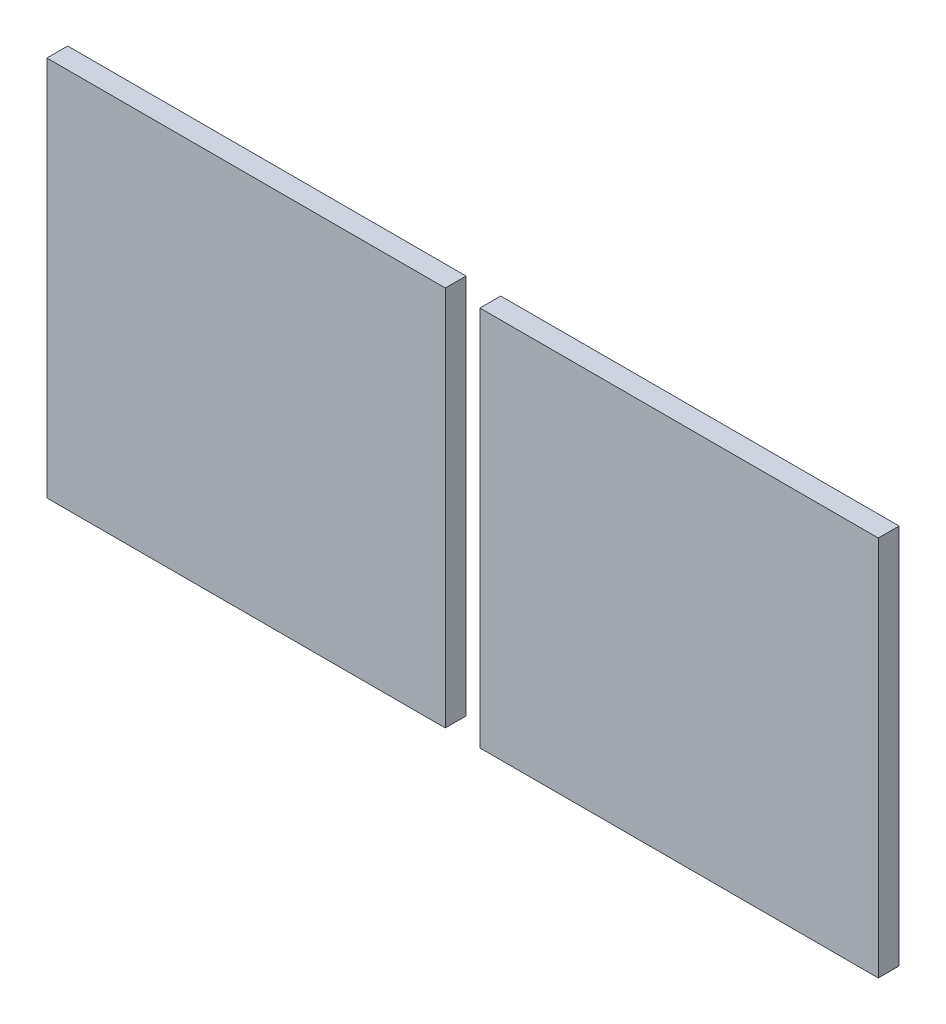
ISO-10303-21;
HEADER;
FILE_DESCRIPTION(('STEP AP214'),'2;1');
FILE_NAME('part.step','',(''),(''),'','','');
FILE_SCHEMA(('AUTOMOTIVE_DESIGN { 1 0 10303 214 1 1 1 1 }'));
ENDSEC;
DATA;
#1=APPLICATION_CONTEXT('core data for automotive mechanical design processes');
#2=APPLICATION_PROTOCOL_DEFINITION('international standard','automotive_design',2000,#1);
#3=PRODUCT_CONTEXT('',#1,'mechanical');
#4=PRODUCT('Part','Part','',(#3));
#5=PRODUCT_RELATED_PRODUCT_CATEGORY('part','',(#4));
#6=PRODUCT_DEFINITION_FORMATION('','',#4);
#7=PRODUCT_DEFINITION_CONTEXT('part definition',#1,'design');
#8=PRODUCT_DEFINITION('design','',#6,#7);
#9=PRODUCT_DEFINITION_SHAPE('','',#8);
#10=(LENGTH_UNIT() NAMED_UNIT(*) SI_UNIT(.MILLI.,.METRE.));
#11=(NAMED_UNIT(*) PLANE_ANGLE_UNIT() SI_UNIT($,.RADIAN.));
#12=(NAMED_UNIT(*) SI_UNIT($,.STERADIAN.) SOLID_ANGLE_UNIT());
#13=UNCERTAINTY_MEASURE_WITH_UNIT(LENGTH_MEASURE(1.E-05),#10,'distance_accuracy_value','');
#14=(GEOMETRIC_REPRESENTATION_CONTEXT(3) GLOBAL_UNCERTAINTY_ASSIGNED_CONTEXT((#13)) GLOBAL_UNIT_ASSIGNED_CONTEXT((#10,
#11,#12)) REPRESENTATION_CONTEXT('',''));
#15=CARTESIAN_POINT('',(0.,0.,0.));
#16=DIRECTION('',(0.,0.,1.));
#17=DIRECTION('',(1.,0.,0.));
#18=AXIS2_PLACEMENT_3D('',#15,#16,#17);
#19=CARTESIAN_POINT('',(120.,55.,-3.));
#20=DIRECTION('',(1.,0.,0.));
#21=DIRECTION('',(0.,1.,0.));
#22=AXIS2_PLACEMENT_3D('',#19,#20,#21);
#23=PLANE('',#22);
#24=DIRECTION('',(0.,1.,0.));
#25=VECTOR('',#24,1.);
#26=CARTESIAN_POINT('',(120.,55.,0.));
#27=LINE('',#26,#25);
#28=CARTESIAN_POINT('',(120.,0.,0.));
#29=VERTEX_POINT('',#28);
#30=CARTESIAN_POINT('',(120.,55.,0.));
#31=VERTEX_POINT('',#30);
#32=EDGE_CURVE('E107',#29,#31,#27,.T.);
#33=ORIENTED_EDGE('',*,*,#32,.F.);
#34=DIRECTION('',(0.,0.,1.));
#35=VECTOR('',#34,1.);
#36=CARTESIAN_POINT('',(120.,0.,-3.));
#37=LINE('',#36,#35);
#38=CARTESIAN_POINT('',(120.,0.,-3.));
#39=VERTEX_POINT('',#38);
#40=EDGE_CURVE('E12',#39,#29,#37,.T.);
#41=ORIENTED_EDGE('',*,*,#40,.F.);
#42=DIRECTION('',(0.,1.,0.));
#43=VECTOR('',#42,1.);
#44=CARTESIAN_POINT('',(120.,55.,-3.));
#45=LINE('',#44,#43);
#46=CARTESIAN_POINT('',(120.,55.,-3.));
#47=VERTEX_POINT('',#46);
#48=EDGE_CURVE('E101',#39,#47,#45,.T.);
#49=ORIENTED_EDGE('',*,*,#48,.T.);
#50=DIRECTION('',(0.,0.,1.));
#51=VECTOR('',#50,1.);
#52=CARTESIAN_POINT('',(120.,55.,-3.));
#53=LINE('',#52,#51);
#54=EDGE_CURVE('E46',#47,#31,#53,.T.);
#55=ORIENTED_EDGE('',*,*,#54,.T.);
#56=EDGE_LOOP('',(#33,#41,#49,#55));
#57=FACE_BOUND('',#56,.T.);
#58=ADVANCED_FACE('F43',(#57),#23,.T.);
#59=CARTESIAN_POINT('',(120.,0.,-3.));
#60=DIRECTION('',(0.,-1.,0.));
#61=DIRECTION('',(1.,0.,0.));
#62=AXIS2_PLACEMENT_3D('',#59,#60,#61);
#63=PLANE('',#62);
#64=DIRECTION('',(1.,0.,0.));
#65=VECTOR('',#64,1.);
#66=CARTESIAN_POINT('',(120.,0.,0.));
#67=LINE('',#66,#65);
#68=CARTESIAN_POINT('',(62.5,0.,0.));
#69=VERTEX_POINT('',#68);
#70=EDGE_CURVE('E103',#69,#29,#67,.T.);
#71=ORIENTED_EDGE('',*,*,#70,.F.);
#72=DIRECTION('',(0.,0.,1.));
#73=VECTOR('',#72,1.);
#74=CARTESIAN_POINT('',(62.5,0.,-3.));
#75=LINE('',#74,#73);
#76=CARTESIAN_POINT('',(62.5,0.,-3.));
#77=VERTEX_POINT('',#76);
#78=EDGE_CURVE('E52',#77,#69,#75,.T.);
#79=ORIENTED_EDGE('',*,*,#78,.F.);
#80=DIRECTION('',(1.,0.,0.));
#81=VECTOR('',#80,1.);
#82=CARTESIAN_POINT('',(120.,0.,-3.));
#83=LINE('',#82,#81);
#84=EDGE_CURVE('E98',#77,#39,#83,.T.);
#85=ORIENTED_EDGE('',*,*,#84,.T.);
#86=ORIENTED_EDGE('',*,*,#40,.T.);
#87=EDGE_LOOP('',(#71,#79,#85,#86));
#88=FACE_BOUND('',#87,.T.);
#89=ADVANCED_FACE('F117',(#88),#63,.T.);
#90=CARTESIAN_POINT('',(62.5,55.,-3.));
#91=DIRECTION('',(-1.,0.,0.));
#92=DIRECTION('',(0.,-1.,0.));
#93=AXIS2_PLACEMENT_3D('',#90,#91,#92);
#94=PLANE('',#93);
#95=DIRECTION('',(0.,-1.,0.));
#96=VECTOR('',#95,1.);
#97=CARTESIAN_POINT('',(62.5,55.,0.));
#98=LINE('',#97,#96);
#99=CARTESIAN_POINT('',(62.5,55.,0.));
#100=VERTEX_POINT('',#99);
#101=EDGE_CURVE('E93',#100,#69,#98,.T.);
#102=ORIENTED_EDGE('',*,*,#101,.F.);
#103=DIRECTION('',(0.,0.,1.));
#104=VECTOR('',#103,1.);
#105=CARTESIAN_POINT('',(62.5,55.,-3.));
#106=LINE('',#105,#104);
#107=CARTESIAN_POINT('',(62.5,55.,-3.));
#108=VERTEX_POINT('',#107);
#109=EDGE_CURVE('E88',#108,#100,#106,.T.);
#110=ORIENTED_EDGE('',*,*,#109,.F.);
#111=DIRECTION('',(0.,-1.,0.));
#112=VECTOR('',#111,1.);
#113=CARTESIAN_POINT('',(62.5,55.,-3.));
#114=LINE('',#113,#112);
#115=EDGE_CURVE('E91',#108,#77,#114,.T.);
#116=ORIENTED_EDGE('',*,*,#115,.T.);
#117=ORIENTED_EDGE('',*,*,#78,.T.);
#118=EDGE_LOOP('',(#102,#110,#116,#117));
#119=FACE_BOUND('',#118,.T.);
#120=ADVANCED_FACE('F90',(#119),#94,.T.);
#121=CARTESIAN_POINT('',(120.,55.,-3.));
#122=DIRECTION('',(0.,1.,0.));
#123=DIRECTION('',(-1.,0.,0.));
#124=AXIS2_PLACEMENT_3D('',#121,#122,#123);
#125=PLANE('',#124);
#126=DIRECTION('',(-1.,0.,0.));
#127=VECTOR('',#126,1.);
#128=CARTESIAN_POINT('',(120.,55.,0.));
#129=LINE('',#128,#127);
#130=EDGE_CURVE('E110',#31,#100,#129,.T.);
#131=ORIENTED_EDGE('',*,*,#130,.F.);
#132=ORIENTED_EDGE('',*,*,#54,.F.);
#133=DIRECTION('',(-1.,0.,0.));
#134=VECTOR('',#133,1.);
#135=CARTESIAN_POINT('',(120.,55.,-3.));
#136=LINE('',#135,#134);
#137=EDGE_CURVE('E97',#47,#108,#136,.T.);
#138=ORIENTED_EDGE('',*,*,#137,.T.);
#139=ORIENTED_EDGE('',*,*,#109,.T.);
#140=EDGE_LOOP('',(#131,#132,#138,#139));
#141=FACE_BOUND('',#140,.T.);
#142=ADVANCED_FACE('F100',(#141),#125,.T.);
#143=CARTESIAN_POINT('',(0.,0.,-3.));
#144=DIRECTION('',(0.,0.,-1.));
#145=DIRECTION('',(-1.,0.,0.));
#146=AXIS2_PLACEMENT_3D('',#143,#144,#145);
#147=PLANE('',#146);
#148=ORIENTED_EDGE('',*,*,#48,.F.);
#149=ORIENTED_EDGE('',*,*,#84,.F.);
#150=ORIENTED_EDGE('',*,*,#115,.F.);
#151=ORIENTED_EDGE('',*,*,#137,.F.);
#152=EDGE_LOOP('',(#148,#149,#150,#151));
#153=FACE_BOUND('',#152,.T.);
#154=ADVANCED_FACE('F96',(#153),#147,.T.);
#155=CARTESIAN_POINT('',(0.,0.,0.));
#156=DIRECTION('',(0.,0.,-1.));
#157=DIRECTION('',(-1.,0.,0.));
#158=AXIS2_PLACEMENT_3D('',#155,#156,#157);
#159=PLANE('',#158);
#160=ORIENTED_EDGE('',*,*,#32,.T.);
#161=ORIENTED_EDGE('',*,*,#130,.T.);
#162=ORIENTED_EDGE('',*,*,#101,.T.);
#163=ORIENTED_EDGE('',*,*,#70,.T.);
#164=EDGE_LOOP('',(#160,#161,#162,#163));
#165=FACE_BOUND('',#164,.T.);
#166=ADVANCED_FACE('F116',(#165),#159,.F.);
#167=CLOSED_SHELL('',(#58,#89,#120,#142,#154,#166));
#168=MANIFOLD_SOLID_BREP('B2',#167);
#169=CARTESIAN_POINT('',(0.,0.,-3.));
#170=DIRECTION('',(-1.,0.,0.));
#171=DIRECTION('',(0.,-1.,0.));
#172=AXIS2_PLACEMENT_3D('',#169,#170,#171);
#173=PLANE('',#172);
#174=DIRECTION('',(0.,-1.,0.));
#175=VECTOR('',#174,1.);
#176=CARTESIAN_POINT('',(0.,0.,0.));
#177=LINE('',#176,#175);
#178=CARTESIAN_POINT('',(0.,55.,0.));
#179=VERTEX_POINT('',#178);
#180=CARTESIAN_POINT('',(0.,0.,0.));
#181=VERTEX_POINT('',#180);
#182=EDGE_CURVE('E231',#179,#181,#177,.T.);
#183=ORIENTED_EDGE('',*,*,#182,.F.);
#184=DIRECTION('',(0.,0.,1.));
#185=VECTOR('',#184,1.);
#186=CARTESIAN_POINT('',(0.,55.,-3.));
#187=LINE('',#186,#185);
#188=CARTESIAN_POINT('',(0.,55.,-3.));
#189=VERTEX_POINT('',#188);
#190=EDGE_CURVE('E41',#189,#179,#187,.T.);
#191=ORIENTED_EDGE('',*,*,#190,.F.);
#192=DIRECTION('',(0.,-1.,0.));
#193=VECTOR('',#192,1.);
#194=CARTESIAN_POINT('',(0.,0.,-3.));
#195=LINE('',#194,#193);
#196=CARTESIAN_POINT('',(0.,0.,-3.));
#197=VERTEX_POINT('',#196);
#198=EDGE_CURVE('E225',#189,#197,#195,.T.);
#199=ORIENTED_EDGE('',*,*,#198,.T.);
#200=DIRECTION('',(0.,0.,1.));
#201=VECTOR('',#200,1.);
#202=CARTESIAN_POINT('',(0.,0.,-3.));
#203=LINE('',#202,#201);
#204=EDGE_CURVE('E170',#197,#181,#203,.T.);
#205=ORIENTED_EDGE('',*,*,#204,.T.);
#206=EDGE_LOOP('',(#183,#191,#199,#205));
#207=FACE_BOUND('',#206,.T.);
#208=ADVANCED_FACE('F167',(#207),#173,.T.);
#209=CARTESIAN_POINT('',(0.,55.,-3.));
#210=DIRECTION('',(0.,1.,0.));
#211=DIRECTION('',(0.,0.,1.));
#212=AXIS2_PLACEMENT_3D('',#209,#210,#211);
#213=PLANE('',#212);
#214=DIRECTION('',(-1.,0.,0.));
#215=VECTOR('',#214,1.);
#216=CARTESIAN_POINT('',(0.,55.,0.));
#217=LINE('',#216,#215);
#218=CARTESIAN_POINT('',(57.5,55.,0.));
#219=VERTEX_POINT('',#218);
#220=EDGE_CURVE('E227',#219,#179,#217,.T.);
#221=ORIENTED_EDGE('',*,*,#220,.F.);
#222=DIRECTION('',(0.,0.,1.));
#223=VECTOR('',#222,1.);
#224=CARTESIAN_POINT('',(57.5,55.,-3.));
#225=LINE('',#224,#223);
#226=CARTESIAN_POINT('',(57.5,55.,-3.));
#227=VERTEX_POINT('',#226);
#228=EDGE_CURVE('E176',#227,#219,#225,.T.);
#229=ORIENTED_EDGE('',*,*,#228,.F.);
#230=DIRECTION('',(-1.,0.,0.));
#231=VECTOR('',#230,1.);
#232=CARTESIAN_POINT('',(0.,55.,-3.));
#233=LINE('',#232,#231);
#234=EDGE_CURVE('E222',#227,#189,#233,.T.);
#235=ORIENTED_EDGE('',*,*,#234,.T.);
#236=ORIENTED_EDGE('',*,*,#190,.T.);
#237=EDGE_LOOP('',(#221,#229,#235,#236));
#238=FACE_BOUND('',#237,.T.);
#239=ADVANCED_FACE('F241',(#238),#213,.T.);
#240=CARTESIAN_POINT('',(57.5,0.,-3.));
#241=DIRECTION('',(1.,0.,0.));
#242=DIRECTION('',(0.,0.,-1.));
#243=AXIS2_PLACEMENT_3D('',#240,#241,#242);
#244=PLANE('',#243);
#245=DIRECTION('',(0.,1.,0.));
#246=VECTOR('',#245,1.);
#247=CARTESIAN_POINT('',(57.5,0.,0.));
#248=LINE('',#247,#246);
#249=CARTESIAN_POINT('',(57.5,0.,0.));
#250=VERTEX_POINT('',#249);
#251=EDGE_CURVE('E217',#250,#219,#248,.T.);
#252=ORIENTED_EDGE('',*,*,#251,.F.);
#253=DIRECTION('',(0.,0.,1.));
#254=VECTOR('',#253,1.);
#255=CARTESIAN_POINT('',(57.5,0.,-3.));
#256=LINE('',#255,#254);
#257=CARTESIAN_POINT('',(57.5,0.,-3.));
#258=VERTEX_POINT('',#257);
#259=EDGE_CURVE('E212',#258,#250,#256,.T.);
#260=ORIENTED_EDGE('',*,*,#259,.F.);
#261=DIRECTION('',(0.,1.,0.));
#262=VECTOR('',#261,1.);
#263=CARTESIAN_POINT('',(57.5,0.,-3.));
#264=LINE('',#263,#262);
#265=EDGE_CURVE('E215',#258,#227,#264,.T.);
#266=ORIENTED_EDGE('',*,*,#265,.T.);
#267=ORIENTED_EDGE('',*,*,#228,.T.);
#268=EDGE_LOOP('',(#252,#260,#266,#267));
#269=FACE_BOUND('',#268,.T.);
#270=ADVANCED_FACE('F214',(#269),#244,.T.);
#271=CARTESIAN_POINT('',(0.,0.,-3.));
#272=DIRECTION('',(0.,-1.,0.));
#273=DIRECTION('',(0.,0.,-1.));
#274=AXIS2_PLACEMENT_3D('',#271,#272,#273);
#275=PLANE('',#274);
#276=DIRECTION('',(1.,0.,0.));
#277=VECTOR('',#276,1.);
#278=CARTESIAN_POINT('',(0.,0.,0.));
#279=LINE('',#278,#277);
#280=EDGE_CURVE('E234',#181,#250,#279,.T.);
#281=ORIENTED_EDGE('',*,*,#280,.F.);
#282=ORIENTED_EDGE('',*,*,#204,.F.);
#283=DIRECTION('',(1.,0.,0.));
#284=VECTOR('',#283,1.);
#285=CARTESIAN_POINT('',(0.,0.,-3.));
#286=LINE('',#285,#284);
#287=EDGE_CURVE('E221',#197,#258,#286,.T.);
#288=ORIENTED_EDGE('',*,*,#287,.T.);
#289=ORIENTED_EDGE('',*,*,#259,.T.);
#290=EDGE_LOOP('',(#281,#282,#288,#289));
#291=FACE_BOUND('',#290,.T.);
#292=ADVANCED_FACE('F224',(#291),#275,.T.);
#293=CARTESIAN_POINT('',(0.,0.,-3.));
#294=DIRECTION('',(0.,0.,-1.));
#295=DIRECTION('',(-1.,0.,0.));
#296=AXIS2_PLACEMENT_3D('',#293,#294,#295);
#297=PLANE('',#296);
#298=ORIENTED_EDGE('',*,*,#198,.F.);
#299=ORIENTED_EDGE('',*,*,#234,.F.);
#300=ORIENTED_EDGE('',*,*,#265,.F.);
#301=ORIENTED_EDGE('',*,*,#287,.F.);
#302=EDGE_LOOP('',(#298,#299,#300,#301));
#303=FACE_BOUND('',#302,.T.);
#304=ADVANCED_FACE('F220',(#303),#297,.T.);
#305=CARTESIAN_POINT('',(0.,0.,0.));
#306=DIRECTION('',(0.,0.,-1.));
#307=DIRECTION('',(-1.,0.,0.));
#308=AXIS2_PLACEMENT_3D('',#305,#306,#307);
#309=PLANE('',#308);
#310=ORIENTED_EDGE('',*,*,#182,.T.);
#311=ORIENTED_EDGE('',*,*,#280,.T.);
#312=ORIENTED_EDGE('',*,*,#251,.T.);
#313=ORIENTED_EDGE('',*,*,#220,.T.);
#314=EDGE_LOOP('',(#310,#311,#312,#313));
#315=FACE_BOUND('',#314,.T.);
#316=ADVANCED_FACE('F240',(#315),#309,.F.);
#317=CLOSED_SHELL('',(#208,#239,#270,#292,#304,#316));
#318=MANIFOLD_SOLID_BREP('B6',#317);
#319=ADVANCED_BREP_SHAPE_REPRESENTATION('',(#18,#168,#318),#14);
#320=SHAPE_DEFINITION_REPRESENTATION(#9,#319);
ENDSEC;
END-ISO-10303-21;
